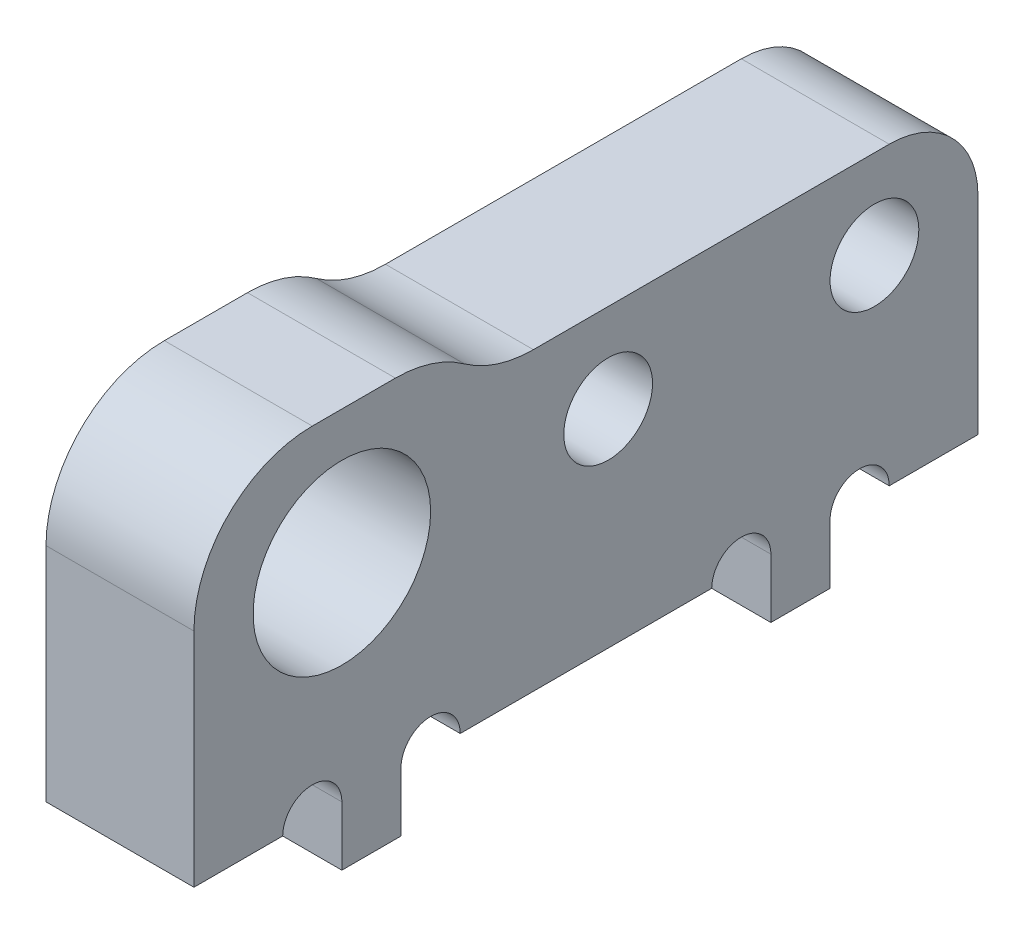
ISO-10303-21;
HEADER;
FILE_DESCRIPTION(('STEP AP214'),'2;1');
FILE_NAME('part.step','',(''),(''),'','','');
FILE_SCHEMA(('AUTOMOTIVE_DESIGN { 1 0 10303 214 1 1 1 1 }'));
ENDSEC;
DATA;
#1=APPLICATION_CONTEXT('core data for automotive mechanical design processes');
#2=APPLICATION_PROTOCOL_DEFINITION('international standard','automotive_design',2000,#1);
#3=PRODUCT_CONTEXT('',#1,'mechanical');
#4=PRODUCT('Part','Part','',(#3));
#5=PRODUCT_RELATED_PRODUCT_CATEGORY('part','',(#4));
#6=PRODUCT_DEFINITION_FORMATION('','',#4);
#7=PRODUCT_DEFINITION_CONTEXT('part definition',#1,'design');
#8=PRODUCT_DEFINITION('design','',#6,#7);
#9=PRODUCT_DEFINITION_SHAPE('','',#8);
#10=(LENGTH_UNIT() NAMED_UNIT(*) SI_UNIT(.MILLI.,.METRE.));
#11=(NAMED_UNIT(*) PLANE_ANGLE_UNIT() SI_UNIT($,.RADIAN.));
#12=(NAMED_UNIT(*) SI_UNIT($,.STERADIAN.) SOLID_ANGLE_UNIT());
#13=UNCERTAINTY_MEASURE_WITH_UNIT(LENGTH_MEASURE(1.E-05),#10,'distance_accuracy_value','');
#14=(GEOMETRIC_REPRESENTATION_CONTEXT(3) GLOBAL_UNCERTAINTY_ASSIGNED_CONTEXT((#13)) GLOBAL_UNIT_ASSIGNED_CONTEXT((#10,
#11,#12)) REPRESENTATION_CONTEXT('',''));
#15=CARTESIAN_POINT('',(0.,0.,0.));
#16=DIRECTION('',(0.,0.,1.));
#17=DIRECTION('',(1.,0.,0.));
#18=AXIS2_PLACEMENT_3D('',#15,#16,#17);
#19=CARTESIAN_POINT('',(0.,0.,0.));
#20=DIRECTION('',(0.,-1.,0.));
#21=DIRECTION('',(0.,0.,-1.));
#22=AXIS2_PLACEMENT_3D('',#19,#20,#21);
#23=PLANE('',#22);
#24=DIRECTION('',(1.,0.,0.));
#25=VECTOR('',#24,1.);
#26=CARTESIAN_POINT('',(-0.0010000000000062,0.,-23.5));
#27=LINE('',#26,#25);
#28=CARTESIAN_POINT('',(0.,0.,-23.5));
#29=VERTEX_POINT('',#28);
#30=CARTESIAN_POINT('',(5.,0.,-23.5));
#31=VERTEX_POINT('',#30);
#32=EDGE_CURVE('E395',#29,#31,#27,.T.);
#33=ORIENTED_EDGE('',*,*,#32,.F.);
#34=DIRECTION('',(0.,0.,1.));
#35=VECTOR('',#34,1.);
#36=CARTESIAN_POINT('',(0.,0.,0.));
#37=LINE('',#36,#35);
#38=CARTESIAN_POINT('',(0.,0.,-26.5));
#39=VERTEX_POINT('',#38);
#40=EDGE_CURVE('E197',#39,#29,#37,.T.);
#41=ORIENTED_EDGE('',*,*,#40,.F.);
#42=DIRECTION('',(-1.,0.,0.));
#43=VECTOR('',#42,1.);
#44=CARTESIAN_POINT('',(0.,0.,-26.5));
#45=LINE('',#44,#43);
#46=CARTESIAN_POINT('',(5.,0.,-26.5));
#47=VERTEX_POINT('',#46);
#48=EDGE_CURVE('E264',#47,#39,#45,.T.);
#49=ORIENTED_EDGE('',*,*,#48,.F.);
#50=DIRECTION('',(0.,0.,-1.));
#51=VECTOR('',#50,1.);
#52=CARTESIAN_POINT('',(5.,0.,0.));
#53=LINE('',#52,#51);
#54=EDGE_CURVE('E273',#31,#47,#53,.T.);
#55=ORIENTED_EDGE('',*,*,#54,.F.);
#56=EDGE_LOOP('',(#33,#41,#49,#55));
#57=FACE_BOUND('',#56,.T.);
#58=ADVANCED_FACE('F37',(#57),#23,.T.);
#59=DIRECTION('',(1.,0.,0.));
#60=VECTOR('',#59,1.);
#61=CARTESIAN_POINT('',(-0.00100000000000534,0.,-17.5));
#62=LINE('',#61,#60);
#63=CARTESIAN_POINT('',(0.,0.,-17.5));
#64=VERTEX_POINT('',#63);
#65=CARTESIAN_POINT('',(5.,0.,-17.5));
#66=VERTEX_POINT('',#65);
#67=EDGE_CURVE('E198',#64,#66,#62,.T.);
#68=ORIENTED_EDGE('',*,*,#67,.T.);
#69=CARTESIAN_POINT('',(5.,0.,-9.));
#70=VERTEX_POINT('',#69);
#71=EDGE_CURVE('E272',#70,#66,#53,.T.);
#72=ORIENTED_EDGE('',*,*,#71,.F.);
#73=DIRECTION('',(1.,0.,0.));
#74=VECTOR('',#73,1.);
#75=CARTESIAN_POINT('',(-0.00100000000000447,0.,-9.));
#76=LINE('',#75,#74);
#77=CARTESIAN_POINT('',(0.,0.,-9.));
#78=VERTEX_POINT('',#77);
#79=EDGE_CURVE('E368',#78,#70,#76,.T.);
#80=ORIENTED_EDGE('',*,*,#79,.F.);
#81=EDGE_CURVE('E280',#64,#78,#37,.T.);
#82=ORIENTED_EDGE('',*,*,#81,.F.);
#83=EDGE_LOOP('',(#68,#72,#80,#82));
#84=FACE_BOUND('',#83,.T.);
#85=ADVANCED_FACE('F366',(#84),#23,.T.);
#86=CARTESIAN_POINT('',(0.,38.4675731203236,0.));
#87=DIRECTION('',(1.,0.,0.));
#88=DIRECTION('',(0.,0.,-1.));
#89=AXIS2_PLACEMENT_3D('',#86,#87,#88);
#90=PLANE('',#89);
#91=CARTESIAN_POINT('',(0.,7.,-23.));
#92=DIRECTION('',(-1.,0.,0.));
#93=DIRECTION('',(0.,0.,1.));
#94=AXIS2_PLACEMENT_3D('',#91,#92,#93);
#95=CIRCLE('',#94,2.25);
#96=CARTESIAN_POINT('',(0.,7.,-20.75));
#97=VERTEX_POINT('',#96);
#98=EDGE_CURVE('E577',#97,#97,#95,.T.);
#99=ORIENTED_EDGE('',*,*,#98,.F.);
#100=EDGE_LOOP('',(#99));
#101=FACE_BOUND('',#100,.T.);
#102=CARTESIAN_POINT('',(0.,7.,-14.));
#103=DIRECTION('',(1.,0.,0.));
#104=DIRECTION('',(0.,0.,-1.));
#105=AXIS2_PLACEMENT_3D('',#102,#103,#104);
#106=CIRCLE('',#105,1.49999999999999);
#107=CARTESIAN_POINT('',(0.,7.,-15.5));
#108=VERTEX_POINT('',#107);
#109=EDGE_CURVE('E251',#108,#108,#106,.T.);
#110=ORIENTED_EDGE('',*,*,#109,.T.);
#111=EDGE_LOOP('',(#110));
#112=FACE_BOUND('',#111,.T.);
#113=CARTESIAN_POINT('',(0.,7.,-5.));
#114=DIRECTION('',(1.,0.,0.));
#115=DIRECTION('',(0.,0.,-1.));
#116=AXIS2_PLACEMENT_3D('',#113,#114,#115);
#117=CIRCLE('',#116,3.);
#118=CARTESIAN_POINT('',(0.,7.,-8.));
#119=VERTEX_POINT('',#118);
#120=EDGE_CURVE('E258',#119,#119,#117,.F.);
#121=ORIENTED_EDGE('',*,*,#120,.F.);
#122=EDGE_LOOP('',(#121));
#123=FACE_BOUND('',#122,.T.);
#124=ORIENTED_EDGE('',*,*,#40,.T.);
#125=CARTESIAN_POINT('',(0.,0.,-22.5));
#126=DIRECTION('',(1.,0.,0.));
#127=DIRECTION('',(0.,0.,-1.));
#128=AXIS2_PLACEMENT_3D('',#125,#126,#127);
#129=CIRCLE('',#128,0.999999999999999);
#130=CARTESIAN_POINT('',(0.,0.,-21.5));
#131=VERTEX_POINT('',#130);
#132=EDGE_CURVE('E180',#131,#29,#129,.F.);
#133=ORIENTED_EDGE('',*,*,#132,.F.);
#134=DIRECTION('',(0.,1.,0.));
#135=VECTOR('',#134,1.);
#136=CARTESIAN_POINT('',(0.,-7.38516480713451,-21.5));
#137=LINE('',#136,#135);
#138=CARTESIAN_POINT('',(0.,-2.,-21.5));
#139=VERTEX_POINT('',#138);
#140=EDGE_CURVE('E194',#139,#131,#137,.T.);
#141=ORIENTED_EDGE('',*,*,#140,.F.);
#142=DIRECTION('',(0.,0.,1.));
#143=VECTOR('',#142,1.);
#144=CARTESIAN_POINT('',(0.,-2.,-19.5));
#145=LINE('',#144,#143);
#146=CARTESIAN_POINT('',(0.,-2.,-19.5));
#147=VERTEX_POINT('',#146);
#148=EDGE_CURVE('E212',#139,#147,#145,.T.);
#149=ORIENTED_EDGE('',*,*,#148,.T.);
#150=DIRECTION('',(0.,1.,0.));
#151=VECTOR('',#150,1.);
#152=CARTESIAN_POINT('',(0.,-7.38516480713451,-19.5));
#153=LINE('',#152,#151);
#154=CARTESIAN_POINT('',(0.,0.,-19.5));
#155=VERTEX_POINT('',#154);
#156=EDGE_CURVE('E202',#147,#155,#153,.T.);
#157=ORIENTED_EDGE('',*,*,#156,.T.);
#158=CARTESIAN_POINT('',(0.,0.,-18.5));
#159=DIRECTION('',(1.,0.,0.));
#160=DIRECTION('',(0.,0.,-1.));
#161=AXIS2_PLACEMENT_3D('',#158,#159,#160);
#162=CIRCLE('',#161,1.);
#163=EDGE_CURVE('E373',#64,#155,#162,.F.);
#164=ORIENTED_EDGE('',*,*,#163,.F.);
#165=ORIENTED_EDGE('',*,*,#81,.T.);
#166=CARTESIAN_POINT('',(0.,0.,-8.));
#167=DIRECTION('',(1.,0.,0.));
#168=DIRECTION('',(0.,0.,-1.));
#169=AXIS2_PLACEMENT_3D('',#166,#167,#168);
#170=CIRCLE('',#169,0.999999999999999);
#171=CARTESIAN_POINT('',(0.,0.,-7.));
#172=VERTEX_POINT('',#171);
#173=EDGE_CURVE('E377',#172,#78,#170,.F.);
#174=ORIENTED_EDGE('',*,*,#173,.F.);
#175=DIRECTION('',(0.,1.,0.));
#176=VECTOR('',#175,1.);
#177=CARTESIAN_POINT('',(0.,-7.38516480713451,-7.));
#178=LINE('',#177,#176);
#179=CARTESIAN_POINT('',(0.,-2.,-7.));
#180=VERTEX_POINT('',#179);
#181=EDGE_CURVE('E233',#180,#172,#178,.T.);
#182=ORIENTED_EDGE('',*,*,#181,.F.);
#183=DIRECTION('',(0.,0.,1.));
#184=VECTOR('',#183,1.);
#185=CARTESIAN_POINT('',(0.,-2.,-5.));
#186=LINE('',#185,#184);
#187=CARTESIAN_POINT('',(0.,-2.,-5.));
#188=VERTEX_POINT('',#187);
#189=EDGE_CURVE('E213',#180,#188,#186,.T.);
#190=ORIENTED_EDGE('',*,*,#189,.T.);
#191=DIRECTION('',(0.,1.,0.));
#192=VECTOR('',#191,1.);
#193=CARTESIAN_POINT('',(0.,-7.38516480713451,-5.));
#194=LINE('',#193,#192);
#195=CARTESIAN_POINT('',(0.,0.,-5.));
#196=VERTEX_POINT('',#195);
#197=EDGE_CURVE('E236',#188,#196,#194,.T.);
#198=ORIENTED_EDGE('',*,*,#197,.T.);
#199=CARTESIAN_POINT('',(0.,0.,-4.));
#200=DIRECTION('',(1.,0.,0.));
#201=DIRECTION('',(0.,0.,-1.));
#202=AXIS2_PLACEMENT_3D('',#199,#200,#201);
#203=CIRCLE('',#202,1.);
#204=CARTESIAN_POINT('',(0.,0.,-3.));
#205=VERTEX_POINT('',#204);
#206=EDGE_CURVE('E382',#205,#196,#203,.F.);
#207=ORIENTED_EDGE('',*,*,#206,.F.);
#208=CARTESIAN_POINT('',(0.,0.,0.));
#209=VERTEX_POINT('',#208);
#210=EDGE_CURVE('E281',#205,#209,#37,.T.);
#211=ORIENTED_EDGE('',*,*,#210,.T.);
#212=DIRECTION('',(0.,-1.,0.));
#213=VECTOR('',#212,1.);
#214=CARTESIAN_POINT('',(0.,38.4675731203236,0.));
#215=LINE('',#214,#213);
#216=CARTESIAN_POINT('',(0.,7.5,0.));
#217=VERTEX_POINT('',#216);
#218=EDGE_CURVE('E278',#217,#209,#215,.T.);
#219=ORIENTED_EDGE('',*,*,#218,.F.);
#220=CARTESIAN_POINT('',(0.,7.5,-4.));
#221=DIRECTION('',(1.,0.,0.));
#222=DIRECTION('',(0.,0.,-1.));
#223=AXIS2_PLACEMENT_3D('',#220,#221,#222);
#224=CIRCLE('',#223,4.);
#225=CARTESIAN_POINT('',(0.,11.5,-4.));
#226=VERTEX_POINT('',#225);
#227=EDGE_CURVE('E309',#217,#226,#224,.F.);
#228=ORIENTED_EDGE('',*,*,#227,.T.);
#229=DIRECTION('',(0.,0.,1.));
#230=VECTOR('',#229,1.);
#231=CARTESIAN_POINT('',(0.,11.5,0.));
#232=LINE('',#231,#230);
#233=CARTESIAN_POINT('',(0.,11.5,-6.80880947265479));
#234=VERTEX_POINT('',#233);
#235=EDGE_CURVE('E267',#234,#226,#232,.T.);
#236=ORIENTED_EDGE('',*,*,#235,.F.);
#237=CARTESIAN_POINT('',(0.,7.5,-6.80880947265479));
#238=DIRECTION('',(1.,0.,0.));
#239=DIRECTION('',(0.,0.,-1.));
#240=AXIS2_PLACEMENT_3D('',#237,#238,#239);
#241=CIRCLE('',#240,4.);
#242=CARTESIAN_POINT('',(0.,10.75,-9.140654235927));
#243=VERTEX_POINT('',#242);
#244=EDGE_CURVE('E11',#234,#243,#241,.F.);
#245=ORIENTED_EDGE('',*,*,#244,.T.);
#246=CARTESIAN_POINT('',(0.,14.,-11.4724989991992));
#247=DIRECTION('',(1.,0.,0.));
#248=DIRECTION('',(0.,0.,-1.));
#249=AXIS2_PLACEMENT_3D('',#246,#247,#248);
#250=CIRCLE('',#249,4.);
#251=CARTESIAN_POINT('',(0.,9.99999999999998,-11.4724989991992));
#252=VERTEX_POINT('',#251);
#253=EDGE_CURVE('E318',#243,#252,#250,.T.);
#254=ORIENTED_EDGE('',*,*,#253,.T.);
#255=DIRECTION('',(0.,0.,1.));
#256=VECTOR('',#255,1.);
#257=CARTESIAN_POINT('',(0.,9.99999999999999,-26.5));
#258=LINE('',#257,#256);
#259=CARTESIAN_POINT('',(0.,9.99999999999999,-23.5));
#260=VERTEX_POINT('',#259);
#261=EDGE_CURVE('E223',#260,#252,#258,.T.);
#262=ORIENTED_EDGE('',*,*,#261,.F.);
#263=CARTESIAN_POINT('',(0.,6.99999999999999,-23.5));
#264=DIRECTION('',(1.,0.,0.));
#265=DIRECTION('',(0.,0.,-1.));
#266=AXIS2_PLACEMENT_3D('',#263,#264,#265);
#267=CIRCLE('',#266,3.);
#268=CARTESIAN_POINT('',(0.,6.99999999999999,-26.5));
#269=VERTEX_POINT('',#268);
#270=EDGE_CURVE('E300',#260,#269,#267,.F.);
#271=ORIENTED_EDGE('',*,*,#270,.T.);
#272=DIRECTION('',(0.,-1.,0.));
#273=VECTOR('',#272,1.);
#274=CARTESIAN_POINT('',(0.,38.4675731203236,-26.5));
#275=LINE('',#274,#273);
#276=EDGE_CURVE('E261',#269,#39,#275,.T.);
#277=ORIENTED_EDGE('',*,*,#276,.T.);
#278=EDGE_LOOP('',(#124,#133,#141,#149,#157,#164,#165,#174,#182,#190,#198,#207,#211,#219,#228,
#236,#245,#254,#262,#271,#277));
#279=FACE_BOUND('',#278,.T.);
#280=ADVANCED_FACE('F192',(#101,#112,#123,#279),#90,.F.);
#281=CARTESIAN_POINT('',(0.,38.4675731203236,0.));
#282=DIRECTION('',(0.,0.,-1.));
#283=DIRECTION('',(-1.,0.,0.));
#284=AXIS2_PLACEMENT_3D('',#281,#282,#283);
#285=PLANE('',#284);
#286=DIRECTION('',(0.,-1.,0.));
#287=VECTOR('',#286,1.);
#288=CARTESIAN_POINT('',(5.,38.4675731203236,0.));
#289=LINE('',#288,#287);
#290=CARTESIAN_POINT('',(5.,7.5,0.));
#291=VERTEX_POINT('',#290);
#292=CARTESIAN_POINT('',(5.,0.,0.));
#293=VERTEX_POINT('',#292);
#294=EDGE_CURVE('E277',#291,#293,#289,.T.);
#295=ORIENTED_EDGE('',*,*,#294,.F.);
#296=DIRECTION('',(1.,0.,0.));
#297=VECTOR('',#296,1.);
#298=CARTESIAN_POINT('',(0.,7.5,0.));
#299=LINE('',#298,#297);
#300=EDGE_CURVE('E307',#291,#217,#299,.F.);
#301=ORIENTED_EDGE('',*,*,#300,.T.);
#302=ORIENTED_EDGE('',*,*,#218,.T.);
#303=DIRECTION('',(1.,0.,0.));
#304=VECTOR('',#303,1.);
#305=CARTESIAN_POINT('',(0.,0.,0.));
#306=LINE('',#305,#304);
#307=EDGE_CURVE('E274',#209,#293,#306,.T.);
#308=ORIENTED_EDGE('',*,*,#307,.T.);
#309=EDGE_LOOP('',(#295,#301,#302,#308));
#310=FACE_BOUND('',#309,.T.);
#311=ADVANCED_FACE('F442',(#310),#285,.F.);
#312=CARTESIAN_POINT('',(5.,38.4675731203236,0.));
#313=DIRECTION('',(-1.,0.,0.));
#314=DIRECTION('',(0.,0.,1.));
#315=AXIS2_PLACEMENT_3D('',#312,#313,#314);
#316=PLANE('',#315);
#317=CARTESIAN_POINT('',(5.,7.,-14.));
#318=DIRECTION('',(1.,0.,0.));
#319=DIRECTION('',(0.,0.,-1.));
#320=AXIS2_PLACEMENT_3D('',#317,#318,#319);
#321=CIRCLE('',#320,1.49999999999999);
#322=CARTESIAN_POINT('',(5.,7.,-15.5));
#323=VERTEX_POINT('',#322);
#324=EDGE_CURVE('E248',#323,#323,#321,.T.);
#325=ORIENTED_EDGE('',*,*,#324,.F.);
#326=EDGE_LOOP('',(#325));
#327=FACE_BOUND('',#326,.T.);
#328=CARTESIAN_POINT('',(5.,7.,-23.));
#329=DIRECTION('',(1.,0.,0.));
#330=DIRECTION('',(0.,0.,-1.));
#331=AXIS2_PLACEMENT_3D('',#328,#329,#330);
#332=CIRCLE('',#331,1.49999999999999);
#333=CARTESIAN_POINT('',(5.,7.,-24.5));
#334=VERTEX_POINT('',#333);
#335=EDGE_CURVE('E254',#334,#334,#332,.T.);
#336=ORIENTED_EDGE('',*,*,#335,.F.);
#337=EDGE_LOOP('',(#336));
#338=FACE_BOUND('',#337,.T.);
#339=CARTESIAN_POINT('',(5.,7.,-5.00000000000001));
#340=DIRECTION('',(1.,0.,0.));
#341=DIRECTION('',(0.,0.,-1.));
#342=AXIS2_PLACEMENT_3D('',#339,#340,#341);
#343=CIRCLE('',#342,3.);
#344=CARTESIAN_POINT('',(5.,7.,-8.00000000000001));
#345=VERTEX_POINT('',#344);
#346=EDGE_CURVE('E257',#345,#345,#343,.T.);
#347=ORIENTED_EDGE('',*,*,#346,.F.);
#348=EDGE_LOOP('',(#347));
#349=FACE_BOUND('',#348,.T.);
#350=DIRECTION('',(0.,1.,0.));
#351=VECTOR('',#350,1.);
#352=CARTESIAN_POINT('',(5.,-7.38516480713451,-21.5));
#353=LINE('',#352,#351);
#354=CARTESIAN_POINT('',(5.,-2.,-21.5));
#355=VERTEX_POINT('',#354);
#356=CARTESIAN_POINT('',(5.,0.,-21.5));
#357=VERTEX_POINT('',#356);
#358=EDGE_CURVE('E186',#355,#357,#353,.T.);
#359=ORIENTED_EDGE('',*,*,#358,.T.);
#360=CARTESIAN_POINT('',(5.,0.,-22.5));
#361=DIRECTION('',(1.,0.,0.));
#362=DIRECTION('',(0.,0.,1.));
#363=AXIS2_PLACEMENT_3D('',#360,#361,#362);
#364=CIRCLE('',#363,0.999999999999999);
#365=EDGE_CURVE('E53',#31,#357,#364,.T.);
#366=ORIENTED_EDGE('',*,*,#365,.F.);
#367=ORIENTED_EDGE('',*,*,#54,.T.);
#368=DIRECTION('',(0.,-1.,0.));
#369=VECTOR('',#368,1.);
#370=CARTESIAN_POINT('',(5.,38.4675731203236,-26.5));
#371=LINE('',#370,#369);
#372=CARTESIAN_POINT('',(5.,6.99999999999999,-26.5));
#373=VERTEX_POINT('',#372);
#374=EDGE_CURVE('E268',#373,#47,#371,.T.);
#375=ORIENTED_EDGE('',*,*,#374,.F.);
#376=CARTESIAN_POINT('',(5.,6.99999999999999,-23.5));
#377=DIRECTION('',(-1.,0.,0.));
#378=DIRECTION('',(0.,0.,1.));
#379=AXIS2_PLACEMENT_3D('',#376,#377,#378);
#380=CIRCLE('',#379,3.);
#381=CARTESIAN_POINT('',(5.,9.99999999999999,-23.5));
#382=VERTEX_POINT('',#381);
#383=EDGE_CURVE('E295',#373,#382,#380,.F.);
#384=ORIENTED_EDGE('',*,*,#383,.T.);
#385=DIRECTION('',(0.,0.,-1.));
#386=VECTOR('',#385,1.);
#387=CARTESIAN_POINT('',(5.,9.99999999999999,-26.5));
#388=LINE('',#387,#386);
#389=CARTESIAN_POINT('',(5.,9.99999999999998,-11.4724989991992));
#390=VERTEX_POINT('',#389);
#391=EDGE_CURVE('E246',#390,#382,#388,.T.);
#392=ORIENTED_EDGE('',*,*,#391,.F.);
#393=CARTESIAN_POINT('',(5.,14.,-11.4724989991992));
#394=DIRECTION('',(-1.,0.,0.));
#395=DIRECTION('',(0.,0.,1.));
#396=AXIS2_PLACEMENT_3D('',#393,#394,#395);
#397=CIRCLE('',#396,4.);
#398=CARTESIAN_POINT('',(5.,10.75,-9.140654235927));
#399=VERTEX_POINT('',#398);
#400=EDGE_CURVE('E315',#390,#399,#397,.T.);
#401=ORIENTED_EDGE('',*,*,#400,.T.);
#402=CARTESIAN_POINT('',(5.,7.5,-6.80880947265479));
#403=DIRECTION('',(-1.,0.,0.));
#404=DIRECTION('',(0.,0.,1.));
#405=AXIS2_PLACEMENT_3D('',#402,#403,#404);
#406=CIRCLE('',#405,4.);
#407=CARTESIAN_POINT('',(5.,11.5,-6.80880947265479));
#408=VERTEX_POINT('',#407);
#409=EDGE_CURVE('E323',#399,#408,#406,.F.);
#410=ORIENTED_EDGE('',*,*,#409,.T.);
#411=DIRECTION('',(0.,0.,-1.));
#412=VECTOR('',#411,1.);
#413=CARTESIAN_POINT('',(5.,11.5,0.));
#414=LINE('',#413,#412);
#415=CARTESIAN_POINT('',(5.,11.5,-4.));
#416=VERTEX_POINT('',#415);
#417=EDGE_CURVE('E282',#416,#408,#414,.T.);
#418=ORIENTED_EDGE('',*,*,#417,.F.);
#419=CARTESIAN_POINT('',(5.,7.5,-4.));
#420=DIRECTION('',(-1.,0.,0.));
#421=DIRECTION('',(0.,0.,1.));
#422=AXIS2_PLACEMENT_3D('',#419,#420,#421);
#423=CIRCLE('',#422,4.);
#424=EDGE_CURVE('E305',#416,#291,#423,.F.);
#425=ORIENTED_EDGE('',*,*,#424,.T.);
#426=ORIENTED_EDGE('',*,*,#294,.T.);
#427=CARTESIAN_POINT('',(5.,0.,-3.));
#428=VERTEX_POINT('',#427);
#429=EDGE_CURVE('E269',#293,#428,#53,.T.);
#430=ORIENTED_EDGE('',*,*,#429,.T.);
#431=CARTESIAN_POINT('',(5.,0.,-4.));
#432=DIRECTION('',(1.,0.,0.));
#433=DIRECTION('',(0.,0.,-1.));
#434=AXIS2_PLACEMENT_3D('',#431,#432,#433);
#435=CIRCLE('',#434,1.);
#436=CARTESIAN_POINT('',(5.,0.,-5.));
#437=VERTEX_POINT('',#436);
#438=EDGE_CURVE('E384',#437,#428,#435,.T.);
#439=ORIENTED_EDGE('',*,*,#438,.F.);
#440=DIRECTION('',(0.,1.,0.));
#441=VECTOR('',#440,1.);
#442=CARTESIAN_POINT('',(5.,-7.38516480713451,-5.));
#443=LINE('',#442,#441);
#444=CARTESIAN_POINT('',(5.,-2.,-5.));
#445=VERTEX_POINT('',#444);
#446=EDGE_CURVE('E239',#445,#437,#443,.T.);
#447=ORIENTED_EDGE('',*,*,#446,.F.);
#448=DIRECTION('',(0.,0.,-1.));
#449=VECTOR('',#448,1.);
#450=CARTESIAN_POINT('',(5.,-2.,-5.));
#451=LINE('',#450,#449);
#452=CARTESIAN_POINT('',(5.,-2.,-7.));
#453=VERTEX_POINT('',#452);
#454=EDGE_CURVE('E220',#445,#453,#451,.T.);
#455=ORIENTED_EDGE('',*,*,#454,.T.);
#456=DIRECTION('',(0.,1.,0.));
#457=VECTOR('',#456,1.);
#458=CARTESIAN_POINT('',(5.,-7.38516480713451,-7.));
#459=LINE('',#458,#457);
#460=CARTESIAN_POINT('',(5.,0.,-7.));
#461=VERTEX_POINT('',#460);
#462=EDGE_CURVE('E231',#453,#461,#459,.T.);
#463=ORIENTED_EDGE('',*,*,#462,.T.);
#464=CARTESIAN_POINT('',(5.,0.,-8.));
#465=DIRECTION('',(1.,0.,0.));
#466=DIRECTION('',(0.,0.,1.));
#467=AXIS2_PLACEMENT_3D('',#464,#465,#466);
#468=CIRCLE('',#467,0.999999999999999);
#469=EDGE_CURVE('E61',#70,#461,#468,.T.);
#470=ORIENTED_EDGE('',*,*,#469,.F.);
#471=ORIENTED_EDGE('',*,*,#71,.T.);
#472=CARTESIAN_POINT('',(5.,0.,-18.5));
#473=DIRECTION('',(1.,0.,0.));
#474=DIRECTION('',(0.,0.,-1.));
#475=AXIS2_PLACEMENT_3D('',#472,#473,#474);
#476=CIRCLE('',#475,1.);
#477=CARTESIAN_POINT('',(5.,0.,-19.5));
#478=VERTEX_POINT('',#477);
#479=EDGE_CURVE('E362',#478,#66,#476,.T.);
#480=ORIENTED_EDGE('',*,*,#479,.F.);
#481=DIRECTION('',(0.,1.,0.));
#482=VECTOR('',#481,1.);
#483=CARTESIAN_POINT('',(5.,-7.38516480713451,-19.5));
#484=LINE('',#483,#482);
#485=CARTESIAN_POINT('',(5.,-2.,-19.5));
#486=VERTEX_POINT('',#485);
#487=EDGE_CURVE('E205',#486,#478,#484,.T.);
#488=ORIENTED_EDGE('',*,*,#487,.F.);
#489=DIRECTION('',(0.,0.,-1.));
#490=VECTOR('',#489,1.);
#491=CARTESIAN_POINT('',(5.,-2.,-19.5));
#492=LINE('',#491,#490);
#493=EDGE_CURVE('E228',#486,#355,#492,.T.);
#494=ORIENTED_EDGE('',*,*,#493,.T.);
#495=EDGE_LOOP('',(#359,#366,#367,#375,#384,#392,#401,#410,#418,#425,#426,#430,#439,#447,#455,
#463,#470,#471,#480,#488,#494));
#496=FACE_BOUND('',#495,.T.);
#497=ADVANCED_FACE('F342',(#327,#338,#349,#496),#316,.F.);
#498=CARTESIAN_POINT('',(0.,38.4675731203236,-26.5));
#499=DIRECTION('',(0.,0.,1.));
#500=DIRECTION('',(1.,0.,0.));
#501=AXIS2_PLACEMENT_3D('',#498,#499,#500);
#502=PLANE('',#501);
#503=ORIENTED_EDGE('',*,*,#276,.F.);
#504=DIRECTION('',(1.,0.,0.));
#505=VECTOR('',#504,1.);
#506=CARTESIAN_POINT('',(0.,6.99999999999999,-26.5));
#507=LINE('',#506,#505);
#508=EDGE_CURVE('E285',#269,#373,#507,.T.);
#509=ORIENTED_EDGE('',*,*,#508,.T.);
#510=ORIENTED_EDGE('',*,*,#374,.T.);
#511=ORIENTED_EDGE('',*,*,#48,.T.);
#512=EDGE_LOOP('',(#503,#509,#510,#511));
#513=FACE_BOUND('',#512,.T.);
#514=ADVANCED_FACE('F354',(#513),#502,.F.);
#515=DIRECTION('',(1.,0.,0.));
#516=VECTOR('',#515,1.);
#517=CARTESIAN_POINT('',(-0.0010000000000036,0.,-3.));
#518=LINE('',#517,#516);
#519=EDGE_CURVE('E379',#205,#428,#518,.T.);
#520=ORIENTED_EDGE('',*,*,#519,.T.);
#521=ORIENTED_EDGE('',*,*,#429,.F.);
#522=ORIENTED_EDGE('',*,*,#307,.F.);
#523=ORIENTED_EDGE('',*,*,#210,.F.);
#524=EDGE_LOOP('',(#520,#521,#522,#523));
#525=FACE_BOUND('',#524,.T.);
#526=ADVANCED_FACE('F416',(#525),#23,.T.);
#527=CARTESIAN_POINT('',(0.,11.5,0.));
#528=DIRECTION('',(0.,1.,0.));
#529=DIRECTION('',(0.,0.,1.));
#530=AXIS2_PLACEMENT_3D('',#527,#528,#529);
#531=PLANE('',#530);
#532=ORIENTED_EDGE('',*,*,#417,.T.);
#533=DIRECTION('',(1.,0.,0.));
#534=VECTOR('',#533,1.);
#535=CARTESIAN_POINT('',(0.,11.5,-6.80880947265479));
#536=LINE('',#535,#534);
#537=EDGE_CURVE('E46',#408,#234,#536,.F.);
#538=ORIENTED_EDGE('',*,*,#537,.T.);
#539=ORIENTED_EDGE('',*,*,#235,.T.);
#540=DIRECTION('',(1.,0.,0.));
#541=VECTOR('',#540,1.);
#542=CARTESIAN_POINT('',(5.,11.5,-4.));
#543=LINE('',#542,#541);
#544=EDGE_CURVE('E302',#226,#416,#543,.T.);
#545=ORIENTED_EDGE('',*,*,#544,.T.);
#546=EDGE_LOOP('',(#532,#538,#539,#545));
#547=FACE_BOUND('',#546,.T.);
#548=ADVANCED_FACE('F328',(#547),#531,.T.);
#549=CARTESIAN_POINT('',(5.,7.,-5.00000000000001));
#550=DIRECTION('',(1.,0.,0.));
#551=DIRECTION('',(0.,0.,-1.));
#552=AXIS2_PLACEMENT_3D('',#549,#550,#551);
#553=CYLINDRICAL_SURFACE('',#552,3.);
#554=ORIENTED_EDGE('',*,*,#120,.T.);
#555=EDGE_LOOP('',(#554));
#556=FACE_BOUND('',#555,.T.);
#557=ORIENTED_EDGE('',*,*,#346,.T.);
#558=EDGE_LOOP('',(#557));
#559=FACE_BOUND('',#558,.T.);
#560=ADVANCED_FACE('F429',(#556,#559),#553,.F.);
#561=CARTESIAN_POINT('',(5.,7.,-23.));
#562=DIRECTION('',(1.,0.,0.));
#563=DIRECTION('',(0.,0.,-1.));
#564=AXIS2_PLACEMENT_3D('',#561,#562,#563);
#565=CYLINDRICAL_SURFACE('',#564,1.49999999999999);
#566=CARTESIAN_POINT('',(1.5,7.,-23.));
#567=DIRECTION('',(1.,0.,0.));
#568=DIRECTION('',(0.,0.,-1.));
#569=AXIS2_PLACEMENT_3D('',#566,#567,#568);
#570=CIRCLE('',#569,1.49999999999999);
#571=CARTESIAN_POINT('',(1.5,7.,-24.5));
#572=VERTEX_POINT('',#571);
#573=EDGE_CURVE('E41',#572,#572,#570,.F.);
#574=ORIENTED_EDGE('',*,*,#573,.T.);
#575=EDGE_LOOP('',(#574));
#576=FACE_BOUND('',#575,.T.);
#577=ORIENTED_EDGE('',*,*,#335,.T.);
#578=EDGE_LOOP('',(#577));
#579=FACE_BOUND('',#578,.T.);
#580=ADVANCED_FACE('F469',(#576,#579),#565,.F.);
#581=CARTESIAN_POINT('',(5.,7.,-14.));
#582=DIRECTION('',(1.,0.,0.));
#583=DIRECTION('',(0.,0.,-1.));
#584=AXIS2_PLACEMENT_3D('',#581,#582,#583);
#585=CYLINDRICAL_SURFACE('',#584,1.49999999999999);
#586=ORIENTED_EDGE('',*,*,#109,.F.);
#587=EDGE_LOOP('',(#586));
#588=FACE_BOUND('',#587,.T.);
#589=ORIENTED_EDGE('',*,*,#324,.T.);
#590=EDGE_LOOP('',(#589));
#591=FACE_BOUND('',#590,.T.);
#592=ADVANCED_FACE('F475',(#588,#591),#585,.F.);
#593=CARTESIAN_POINT('',(-0.00100000000000707,9.99999999999999,-26.5));
#594=DIRECTION('',(0.,-1.,0.));
#595=DIRECTION('',(0.,0.,-1.));
#596=AXIS2_PLACEMENT_3D('',#593,#594,#595);
#597=PLANE('',#596);
#598=ORIENTED_EDGE('',*,*,#261,.T.);
#599=DIRECTION('',(-1.,0.,0.));
#600=VECTOR('',#599,1.);
#601=CARTESIAN_POINT('',(-0.00100000000000446,9.99999999999998,-11.4724989991992));
#602=LINE('',#601,#600);
#603=EDGE_CURVE('E312',#252,#390,#602,.F.);
#604=ORIENTED_EDGE('',*,*,#603,.T.);
#605=ORIENTED_EDGE('',*,*,#391,.T.);
#606=DIRECTION('',(1.,0.,0.));
#607=VECTOR('',#606,1.);
#608=CARTESIAN_POINT('',(-0.00100000000000707,9.99999999999999,-23.5));
#609=LINE('',#608,#607);
#610=EDGE_CURVE('E298',#382,#260,#609,.F.);
#611=ORIENTED_EDGE('',*,*,#610,.T.);
#612=EDGE_LOOP('',(#598,#604,#605,#611));
#613=FACE_BOUND('',#612,.T.);
#614=ADVANCED_FACE('F346',(#613),#597,.F.);
#615=CARTESIAN_POINT('',(0.,6.99999999999999,-23.5));
#616=DIRECTION('',(1.,0.,0.));
#617=DIRECTION('',(0.,1.,0.));
#618=AXIS2_PLACEMENT_3D('',#615,#616,#617);
#619=CYLINDRICAL_SURFACE('',#618,3.);
#620=ORIENTED_EDGE('',*,*,#270,.F.);
#621=ORIENTED_EDGE('',*,*,#610,.F.);
#622=ORIENTED_EDGE('',*,*,#383,.F.);
#623=ORIENTED_EDGE('',*,*,#508,.F.);
#624=EDGE_LOOP('',(#620,#621,#622,#623));
#625=FACE_BOUND('',#624,.T.);
#626=ADVANCED_FACE('F352',(#625),#619,.T.);
#627=CARTESIAN_POINT('',(0.,7.5,-4.));
#628=DIRECTION('',(-1.,0.,0.));
#629=DIRECTION('',(0.,0.,1.));
#630=AXIS2_PLACEMENT_3D('',#627,#628,#629);
#631=CYLINDRICAL_SURFACE('',#630,4.);
#632=ORIENTED_EDGE('',*,*,#227,.F.);
#633=ORIENTED_EDGE('',*,*,#300,.F.);
#634=ORIENTED_EDGE('',*,*,#424,.F.);
#635=ORIENTED_EDGE('',*,*,#544,.F.);
#636=EDGE_LOOP('',(#632,#633,#634,#635));
#637=FACE_BOUND('',#636,.T.);
#638=ADVANCED_FACE('F444',(#637),#631,.T.);
#639=CARTESIAN_POINT('',(-0.00100000000000501,14.,-11.4724989991992));
#640=DIRECTION('',(-1.,0.,0.));
#641=DIRECTION('',(0.,0.,1.));
#642=AXIS2_PLACEMENT_3D('',#639,#640,#641);
#643=CYLINDRICAL_SURFACE('',#642,4.);
#644=ORIENTED_EDGE('',*,*,#253,.F.);
#645=DIRECTION('',(-1.,0.,0.));
#646=VECTOR('',#645,1.);
#647=CARTESIAN_POINT('',(-0.00100000000000461,10.75,-9.140654235927));
#648=LINE('',#647,#646);
#649=EDGE_CURVE('E320',#243,#399,#648,.F.);
#650=ORIENTED_EDGE('',*,*,#649,.T.);
#651=ORIENTED_EDGE('',*,*,#400,.F.);
#652=ORIENTED_EDGE('',*,*,#603,.F.);
#653=EDGE_LOOP('',(#644,#650,#651,#652));
#654=FACE_BOUND('',#653,.T.);
#655=ADVANCED_FACE('F338',(#654),#643,.F.);
#656=CARTESIAN_POINT('',(-0.0010000000000042,7.5,-6.80880947265479));
#657=DIRECTION('',(-1.,0.,0.));
#658=DIRECTION('',(0.,0.,1.));
#659=AXIS2_PLACEMENT_3D('',#656,#657,#658);
#660=CYLINDRICAL_SURFACE('',#659,4.);
#661=ORIENTED_EDGE('',*,*,#244,.F.);
#662=ORIENTED_EDGE('',*,*,#537,.F.);
#663=ORIENTED_EDGE('',*,*,#409,.F.);
#664=ORIENTED_EDGE('',*,*,#649,.F.);
#665=EDGE_LOOP('',(#661,#662,#663,#664));
#666=FACE_BOUND('',#665,.T.);
#667=ADVANCED_FACE('F39',(#666),#660,.T.);
#668=CARTESIAN_POINT('',(5.,-7.38516480713451,-7.));
#669=DIRECTION('',(0.,0.,1.));
#670=DIRECTION('',(1.,0.,0.));
#671=AXIS2_PLACEMENT_3D('',#668,#669,#670);
#672=PLANE('',#671);
#673=ORIENTED_EDGE('',*,*,#462,.F.);
#674=DIRECTION('',(-1.,0.,0.));
#675=VECTOR('',#674,1.);
#676=CARTESIAN_POINT('',(5.,-2.,-7.));
#677=LINE('',#676,#675);
#678=EDGE_CURVE('E217',#453,#180,#677,.T.);
#679=ORIENTED_EDGE('',*,*,#678,.T.);
#680=ORIENTED_EDGE('',*,*,#181,.T.);
#681=DIRECTION('',(1.,0.,0.));
#682=VECTOR('',#681,1.);
#683=CARTESIAN_POINT('',(5.,0.,-7.));
#684=LINE('',#683,#682);
#685=EDGE_CURVE('E227',#172,#461,#684,.T.);
#686=ORIENTED_EDGE('',*,*,#685,.T.);
#687=EDGE_LOOP('',(#673,#679,#680,#686));
#688=FACE_BOUND('',#687,.T.);
#689=ADVANCED_FACE('F488',(#688),#672,.F.);
#690=CARTESIAN_POINT('',(5.,-7.38516480713451,-5.));
#691=DIRECTION('',(0.,0.,-1.));
#692=DIRECTION('',(-1.,0.,0.));
#693=AXIS2_PLACEMENT_3D('',#690,#691,#692);
#694=PLANE('',#693);
#695=ORIENTED_EDGE('',*,*,#197,.F.);
#696=DIRECTION('',(1.,0.,0.));
#697=VECTOR('',#696,1.);
#698=CARTESIAN_POINT('',(5.,-2.,-5.));
#699=LINE('',#698,#697);
#700=EDGE_CURVE('E216',#188,#445,#699,.T.);
#701=ORIENTED_EDGE('',*,*,#700,.T.);
#702=ORIENTED_EDGE('',*,*,#446,.T.);
#703=DIRECTION('',(-1.,0.,0.));
#704=VECTOR('',#703,1.);
#705=CARTESIAN_POINT('',(5.,0.,-5.));
#706=LINE('',#705,#704);
#707=EDGE_CURVE('E224',#437,#196,#706,.T.);
#708=ORIENTED_EDGE('',*,*,#707,.T.);
#709=EDGE_LOOP('',(#695,#701,#702,#708));
#710=FACE_BOUND('',#709,.T.);
#711=ADVANCED_FACE('F484',(#710),#694,.F.);
#712=CARTESIAN_POINT('',(0.,-2.,0.));
#713=DIRECTION('',(0.,1.,0.));
#714=DIRECTION('',(0.,0.,1.));
#715=AXIS2_PLACEMENT_3D('',#712,#713,#714);
#716=PLANE('',#715);
#717=ORIENTED_EDGE('',*,*,#700,.F.);
#718=ORIENTED_EDGE('',*,*,#189,.F.);
#719=ORIENTED_EDGE('',*,*,#678,.F.);
#720=ORIENTED_EDGE('',*,*,#454,.F.);
#721=EDGE_LOOP('',(#717,#718,#719,#720));
#722=FACE_BOUND('',#721,.T.);
#723=ADVANCED_FACE('F487',(#722),#716,.F.);
#724=CARTESIAN_POINT('',(5.,-7.38516480713451,-21.5));
#725=DIRECTION('',(0.,0.,1.));
#726=DIRECTION('',(1.,0.,0.));
#727=AXIS2_PLACEMENT_3D('',#724,#725,#726);
#728=PLANE('',#727);
#729=ORIENTED_EDGE('',*,*,#358,.F.);
#730=DIRECTION('',(-1.,0.,0.));
#731=VECTOR('',#730,1.);
#732=CARTESIAN_POINT('',(5.,-2.,-21.5));
#733=LINE('',#732,#731);
#734=EDGE_CURVE('E201',#355,#139,#733,.T.);
#735=ORIENTED_EDGE('',*,*,#734,.T.);
#736=ORIENTED_EDGE('',*,*,#140,.T.);
#737=DIRECTION('',(1.,0.,0.));
#738=VECTOR('',#737,1.);
#739=CARTESIAN_POINT('',(5.,0.,-21.5));
#740=LINE('',#739,#738);
#741=EDGE_CURVE('E177',#131,#357,#740,.T.);
#742=ORIENTED_EDGE('',*,*,#741,.T.);
#743=EDGE_LOOP('',(#729,#735,#736,#742));
#744=FACE_BOUND('',#743,.T.);
#745=ADVANCED_FACE('F200',(#744),#728,.F.);
#746=CARTESIAN_POINT('',(5.,-7.38516480713451,-19.5));
#747=DIRECTION('',(0.,0.,-1.));
#748=DIRECTION('',(-1.,0.,0.));
#749=AXIS2_PLACEMENT_3D('',#746,#747,#748);
#750=PLANE('',#749);
#751=ORIENTED_EDGE('',*,*,#156,.F.);
#752=DIRECTION('',(1.,0.,0.));
#753=VECTOR('',#752,1.);
#754=CARTESIAN_POINT('',(5.,-2.,-19.5));
#755=LINE('',#754,#753);
#756=EDGE_CURVE('E389',#147,#486,#755,.T.);
#757=ORIENTED_EDGE('',*,*,#756,.T.);
#758=ORIENTED_EDGE('',*,*,#487,.T.);
#759=DIRECTION('',(-1.,0.,0.));
#760=VECTOR('',#759,1.);
#761=CARTESIAN_POINT('',(5.,0.,-19.5));
#762=LINE('',#761,#760);
#763=EDGE_CURVE('E187',#478,#155,#762,.T.);
#764=ORIENTED_EDGE('',*,*,#763,.T.);
#765=EDGE_LOOP('',(#751,#757,#758,#764));
#766=FACE_BOUND('',#765,.T.);
#767=ADVANCED_FACE('F401',(#766),#750,.F.);
#768=CARTESIAN_POINT('',(0.,-2.,0.));
#769=DIRECTION('',(0.,1.,0.));
#770=DIRECTION('',(0.,0.,1.));
#771=AXIS2_PLACEMENT_3D('',#768,#769,#770);
#772=PLANE('',#771);
#773=ORIENTED_EDGE('',*,*,#756,.F.);
#774=ORIENTED_EDGE('',*,*,#148,.F.);
#775=ORIENTED_EDGE('',*,*,#734,.F.);
#776=ORIENTED_EDGE('',*,*,#493,.F.);
#777=EDGE_LOOP('',(#773,#774,#775,#776));
#778=FACE_BOUND('',#777,.T.);
#779=ADVANCED_FACE('F403',(#778),#772,.F.);
#780=CARTESIAN_POINT('',(-0.00100000000000534,0.,-18.5));
#781=DIRECTION('',(1.,0.,0.));
#782=DIRECTION('',(0.,0.,-1.));
#783=AXIS2_PLACEMENT_3D('',#780,#781,#782);
#784=CYLINDRICAL_SURFACE('',#783,1.);
#785=ORIENTED_EDGE('',*,*,#163,.T.);
#786=ORIENTED_EDGE('',*,*,#763,.F.);
#787=ORIENTED_EDGE('',*,*,#479,.T.);
#788=ORIENTED_EDGE('',*,*,#67,.F.);
#789=EDGE_LOOP('',(#785,#786,#787,#788));
#790=FACE_BOUND('',#789,.T.);
#791=ADVANCED_FACE('F400',(#790),#784,.F.);
#792=CARTESIAN_POINT('',(-0.0010000000000062,0.,-22.5));
#793=DIRECTION('',(1.,0.,0.));
#794=DIRECTION('',(0.,0.,-1.));
#795=AXIS2_PLACEMENT_3D('',#792,#793,#794);
#796=CYLINDRICAL_SURFACE('',#795,0.999999999999999);
#797=ORIENTED_EDGE('',*,*,#132,.T.);
#798=ORIENTED_EDGE('',*,*,#32,.T.);
#799=ORIENTED_EDGE('',*,*,#365,.T.);
#800=ORIENTED_EDGE('',*,*,#741,.F.);
#801=EDGE_LOOP('',(#797,#798,#799,#800));
#802=FACE_BOUND('',#801,.T.);
#803=ADVANCED_FACE('F179',(#802),#796,.F.);
#804=CARTESIAN_POINT('',(-0.0010000000000036,0.,-4.));
#805=DIRECTION('',(1.,0.,0.));
#806=DIRECTION('',(0.,0.,-1.));
#807=AXIS2_PLACEMENT_3D('',#804,#805,#806);
#808=CYLINDRICAL_SURFACE('',#807,1.);
#809=ORIENTED_EDGE('',*,*,#206,.T.);
#810=ORIENTED_EDGE('',*,*,#707,.F.);
#811=ORIENTED_EDGE('',*,*,#438,.T.);
#812=ORIENTED_EDGE('',*,*,#519,.F.);
#813=EDGE_LOOP('',(#809,#810,#811,#812));
#814=FACE_BOUND('',#813,.T.);
#815=ADVANCED_FACE('F520',(#814),#808,.F.);
#816=CARTESIAN_POINT('',(-0.00100000000000447,0.,-8.));
#817=DIRECTION('',(1.,0.,0.));
#818=DIRECTION('',(0.,0.,-1.));
#819=AXIS2_PLACEMENT_3D('',#816,#817,#818);
#820=CYLINDRICAL_SURFACE('',#819,0.999999999999999);
#821=ORIENTED_EDGE('',*,*,#173,.T.);
#822=ORIENTED_EDGE('',*,*,#79,.T.);
#823=ORIENTED_EDGE('',*,*,#469,.T.);
#824=ORIENTED_EDGE('',*,*,#685,.F.);
#825=EDGE_LOOP('',(#821,#822,#823,#824));
#826=FACE_BOUND('',#825,.T.);
#827=ADVANCED_FACE('F529',(#826),#820,.F.);
#828=CARTESIAN_POINT('',(1.5,7.,-23.));
#829=DIRECTION('',(1.,0.,0.));
#830=DIRECTION('',(0.,0.,-1.));
#831=AXIS2_PLACEMENT_3D('',#828,#829,#830);
#832=PLANE('',#831);
#833=CARTESIAN_POINT('',(1.5,7.,-23.));
#834=DIRECTION('',(-1.,0.,0.));
#835=DIRECTION('',(0.,0.,1.));
#836=AXIS2_PLACEMENT_3D('',#833,#834,#835);
#837=CIRCLE('',#836,2.25);
#838=CARTESIAN_POINT('',(1.5,7.,-20.75));
#839=VERTEX_POINT('',#838);
#840=EDGE_CURVE('E574',#839,#839,#837,.T.);
#841=ORIENTED_EDGE('',*,*,#840,.T.);
#842=EDGE_LOOP('',(#841));
#843=FACE_BOUND('',#842,.T.);
#844=ORIENTED_EDGE('',*,*,#573,.F.);
#845=EDGE_LOOP('',(#844));
#846=FACE_BOUND('',#845,.T.);
#847=ADVANCED_FACE('F537',(#843,#846),#832,.F.);
#848=CARTESIAN_POINT('',(0.,7.,-23.));
#849=DIRECTION('',(-1.,0.,0.));
#850=DIRECTION('',(0.,0.,1.));
#851=AXIS2_PLACEMENT_3D('',#848,#849,#850);
#852=CYLINDRICAL_SURFACE('',#851,2.25);
#853=ORIENTED_EDGE('',*,*,#840,.F.);
#854=EDGE_LOOP('',(#853));
#855=FACE_BOUND('',#854,.T.);
#856=ORIENTED_EDGE('',*,*,#98,.T.);
#857=EDGE_LOOP('',(#856));
#858=FACE_BOUND('',#857,.T.);
#859=ADVANCED_FACE('F557',(#855,#858),#852,.F.);
#860=CLOSED_SHELL('',(#58,#85,#280,#311,#497,#514,#526,#548,#560,#580,#592,#614,#626,#638,#655,
#667,#689,#711,#723,#745,#767,#779,#791,#803,#815,#827,#847,#859));
#861=MANIFOLD_SOLID_BREP('B2',#860);
#862=ADVANCED_BREP_SHAPE_REPRESENTATION('',(#18,#861),#14);
#863=SHAPE_DEFINITION_REPRESENTATION(#9,#862);
ENDSEC;
END-ISO-10303-21;
